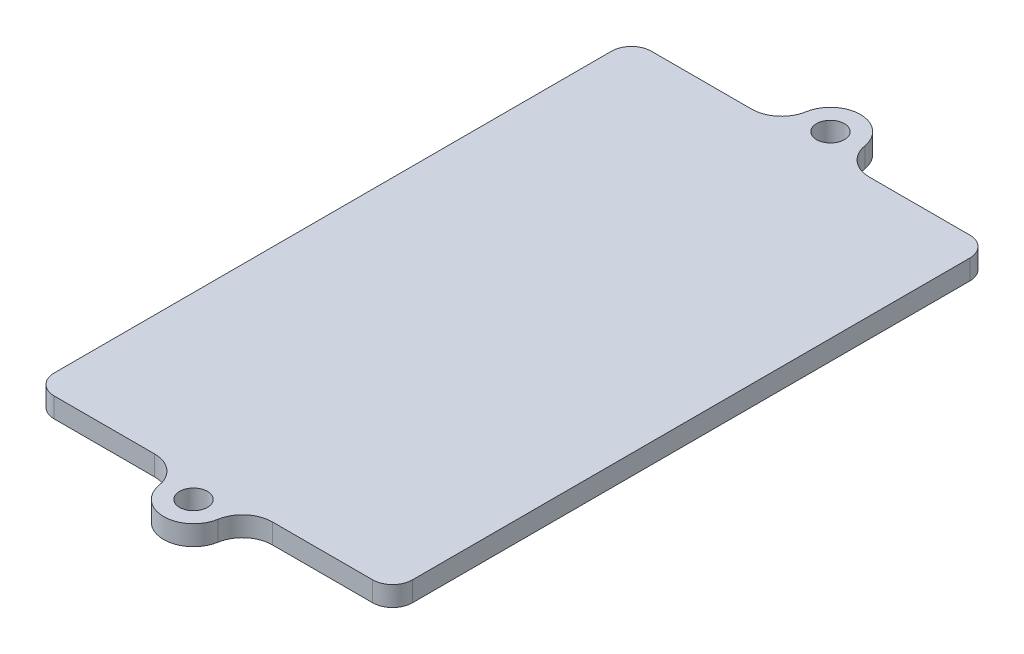
ISO-10303-21;
HEADER;
FILE_DESCRIPTION(('STEP AP214'),'2;1');
FILE_NAME('part.step','',(''),(''),'','','');
FILE_SCHEMA(('AUTOMOTIVE_DESIGN { 1 0 10303 214 1 1 1 1 }'));
ENDSEC;
DATA;
#1=APPLICATION_CONTEXT('core data for automotive mechanical design processes');
#2=APPLICATION_PROTOCOL_DEFINITION('international standard','automotive_design',2000,#1);
#3=PRODUCT_CONTEXT('',#1,'mechanical');
#4=PRODUCT('Part','Part','',(#3));
#5=PRODUCT_RELATED_PRODUCT_CATEGORY('part','',(#4));
#6=PRODUCT_DEFINITION_FORMATION('','',#4);
#7=PRODUCT_DEFINITION_CONTEXT('part definition',#1,'design');
#8=PRODUCT_DEFINITION('design','',#6,#7);
#9=PRODUCT_DEFINITION_SHAPE('','',#8);
#10=(LENGTH_UNIT() NAMED_UNIT(*) SI_UNIT(.MILLI.,.METRE.));
#11=(NAMED_UNIT(*) PLANE_ANGLE_UNIT() SI_UNIT($,.RADIAN.));
#12=(NAMED_UNIT(*) SI_UNIT($,.STERADIAN.) SOLID_ANGLE_UNIT());
#13=UNCERTAINTY_MEASURE_WITH_UNIT(LENGTH_MEASURE(1.E-05),#10,'distance_accuracy_value','');
#14=(GEOMETRIC_REPRESENTATION_CONTEXT(3) GLOBAL_UNCERTAINTY_ASSIGNED_CONTEXT((#13)) GLOBAL_UNIT_ASSIGNED_CONTEXT((#10,
#11,#12)) REPRESENTATION_CONTEXT('',''));
#15=CARTESIAN_POINT('',(0.,0.,0.));
#16=DIRECTION('',(0.,0.,1.));
#17=DIRECTION('',(1.,0.,0.));
#18=AXIS2_PLACEMENT_3D('',#15,#16,#17);
#19=CARTESIAN_POINT('',(-18.,2.,30.));
#20=DIRECTION('',(0.,0.,-1.));
#21=DIRECTION('',(-1.,0.,0.));
#22=AXIS2_PLACEMENT_3D('',#19,#20,#21);
#23=PLANE('',#22);
#24=DIRECTION('',(1.,0.,0.));
#25=VECTOR('',#24,1.);
#26=CARTESIAN_POINT('',(-18.,0.,30.));
#27=LINE('',#26,#25);
#28=CARTESIAN_POINT('',(-16.,0.,30.));
#29=VERTEX_POINT('',#28);
#30=CARTESIAN_POINT('',(-5.91607978309962,0.,30.));
#31=VERTEX_POINT('',#30);
#32=EDGE_CURVE('E172',#29,#31,#27,.T.);
#33=ORIENTED_EDGE('',*,*,#32,.T.);
#34=DIRECTION('',(0.,-1.,0.));
#35=VECTOR('',#34,1.);
#36=CARTESIAN_POINT('',(-5.91607978309962,2.,30.));
#37=LINE('',#36,#35);
#38=CARTESIAN_POINT('',(-5.91607978309962,2.,30.));
#39=VERTEX_POINT('',#38);
#40=EDGE_CURVE('E247',#31,#39,#37,.F.);
#41=ORIENTED_EDGE('',*,*,#40,.T.);
#42=DIRECTION('',(1.,0.,0.));
#43=VECTOR('',#42,1.);
#44=CARTESIAN_POINT('',(-18.,2.,30.));
#45=LINE('',#44,#43);
#46=CARTESIAN_POINT('',(-16.,2.,30.));
#47=VERTEX_POINT('',#46);
#48=EDGE_CURVE('E175',#47,#39,#45,.T.);
#49=ORIENTED_EDGE('',*,*,#48,.F.);
#50=DIRECTION('',(0.,-1.,0.));
#51=VECTOR('',#50,1.);
#52=CARTESIAN_POINT('',(-16.,2.,30.));
#53=LINE('',#52,#51);
#54=EDGE_CURVE('E159',#47,#29,#53,.T.);
#55=ORIENTED_EDGE('',*,*,#54,.T.);
#56=EDGE_LOOP('',(#33,#41,#49,#55));
#57=FACE_BOUND('',#56,.T.);
#58=ADVANCED_FACE('F41',(#57),#23,.F.);
#59=CARTESIAN_POINT('',(5.91607978309962,2.,30.));
#60=VERTEX_POINT('',#59);
#61=CARTESIAN_POINT('',(16.,2.,30.));
#62=VERTEX_POINT('',#61);
#63=EDGE_CURVE('E327',#60,#62,#45,.T.);
#64=ORIENTED_EDGE('',*,*,#63,.F.);
#65=DIRECTION('',(0.,-1.,0.));
#66=VECTOR('',#65,1.);
#67=CARTESIAN_POINT('',(5.91607978309962,0.,30.));
#68=LINE('',#67,#66);
#69=CARTESIAN_POINT('',(5.91607978309962,0.,30.));
#70=VERTEX_POINT('',#69);
#71=EDGE_CURVE('E257',#60,#70,#68,.T.);
#72=ORIENTED_EDGE('',*,*,#71,.T.);
#73=CARTESIAN_POINT('',(16.,0.,30.));
#74=VERTEX_POINT('',#73);
#75=EDGE_CURVE('E187',#70,#74,#27,.T.);
#76=ORIENTED_EDGE('',*,*,#75,.T.);
#77=DIRECTION('',(0.,-1.,0.));
#78=VECTOR('',#77,1.);
#79=CARTESIAN_POINT('',(16.,2.,30.));
#80=LINE('',#79,#78);
#81=EDGE_CURVE('E178',#74,#62,#80,.F.);
#82=ORIENTED_EDGE('',*,*,#81,.T.);
#83=EDGE_LOOP('',(#64,#72,#76,#82));
#84=FACE_BOUND('',#83,.T.);
#85=ADVANCED_FACE('F393',(#84),#23,.F.);
#86=CARTESIAN_POINT('',(-18.,2.,-30.));
#87=DIRECTION('',(0.,0.,1.));
#88=DIRECTION('',(1.,0.,0.));
#89=AXIS2_PLACEMENT_3D('',#86,#87,#88);
#90=PLANE('',#89);
#91=DIRECTION('',(-1.,0.,0.));
#92=VECTOR('',#91,1.);
#93=CARTESIAN_POINT('',(-18.,0.,-30.));
#94=LINE('',#93,#92);
#95=CARTESIAN_POINT('',(16.,0.,-30.));
#96=VERTEX_POINT('',#95);
#97=CARTESIAN_POINT('',(5.91607978309962,0.,-30.));
#98=VERTEX_POINT('',#97);
#99=EDGE_CURVE('E198',#96,#98,#94,.T.);
#100=ORIENTED_EDGE('',*,*,#99,.T.);
#101=DIRECTION('',(0.,1.,0.));
#102=VECTOR('',#101,1.);
#103=CARTESIAN_POINT('',(5.91607978309962,2.,-30.));
#104=LINE('',#103,#102);
#105=CARTESIAN_POINT('',(5.91607978309962,2.,-30.));
#106=VERTEX_POINT('',#105);
#107=EDGE_CURVE('E270',#98,#106,#104,.T.);
#108=ORIENTED_EDGE('',*,*,#107,.T.);
#109=DIRECTION('',(-1.,0.,0.));
#110=VECTOR('',#109,1.);
#111=CARTESIAN_POINT('',(-18.,2.,-30.));
#112=LINE('',#111,#110);
#113=CARTESIAN_POINT('',(16.,2.,-30.));
#114=VERTEX_POINT('',#113);
#115=EDGE_CURVE('E204',#114,#106,#112,.T.);
#116=ORIENTED_EDGE('',*,*,#115,.F.);
#117=DIRECTION('',(0.,-1.,0.));
#118=VECTOR('',#117,1.);
#119=CARTESIAN_POINT('',(16.,2.,-30.));
#120=LINE('',#119,#118);
#121=EDGE_CURVE('E243',#114,#96,#120,.T.);
#122=ORIENTED_EDGE('',*,*,#121,.T.);
#123=EDGE_LOOP('',(#100,#108,#116,#122));
#124=FACE_BOUND('',#123,.T.);
#125=ADVANCED_FACE('F308',(#124),#90,.F.);
#126=CARTESIAN_POINT('',(-18.,2.,-30.));
#127=DIRECTION('',(1.,0.,0.));
#128=DIRECTION('',(0.,0.,-1.));
#129=AXIS2_PLACEMENT_3D('',#126,#127,#128);
#130=PLANE('',#129);
#131=DIRECTION('',(0.,0.,1.));
#132=VECTOR('',#131,1.);
#133=CARTESIAN_POINT('',(-18.,0.,-30.));
#134=LINE('',#133,#132);
#135=CARTESIAN_POINT('',(-18.,0.,-28.));
#136=VERTEX_POINT('',#135);
#137=CARTESIAN_POINT('',(-18.,0.,28.));
#138=VERTEX_POINT('',#137);
#139=EDGE_CURVE('E194',#136,#138,#134,.T.);
#140=ORIENTED_EDGE('',*,*,#139,.T.);
#141=DIRECTION('',(0.,-1.,0.));
#142=VECTOR('',#141,1.);
#143=CARTESIAN_POINT('',(-18.,2.,28.));
#144=LINE('',#143,#142);
#145=CARTESIAN_POINT('',(-18.,2.,28.));
#146=VERTEX_POINT('',#145);
#147=EDGE_CURVE('E160',#138,#146,#144,.F.);
#148=ORIENTED_EDGE('',*,*,#147,.T.);
#149=DIRECTION('',(0.,0.,1.));
#150=VECTOR('',#149,1.);
#151=CARTESIAN_POINT('',(-18.,2.,-30.));
#152=LINE('',#151,#150);
#153=CARTESIAN_POINT('',(-18.,2.,-28.));
#154=VERTEX_POINT('',#153);
#155=EDGE_CURVE('E201',#154,#146,#152,.T.);
#156=ORIENTED_EDGE('',*,*,#155,.F.);
#157=DIRECTION('',(0.,-1.,0.));
#158=VECTOR('',#157,1.);
#159=CARTESIAN_POINT('',(-18.,2.,-28.));
#160=LINE('',#159,#158);
#161=EDGE_CURVE('E165',#154,#136,#160,.T.);
#162=ORIENTED_EDGE('',*,*,#161,.T.);
#163=EDGE_LOOP('',(#140,#148,#156,#162));
#164=FACE_BOUND('',#163,.T.);
#165=ADVANCED_FACE('F369',(#164),#130,.F.);
#166=CARTESIAN_POINT('',(18.,2.,-30.));
#167=DIRECTION('',(-1.,0.,0.));
#168=DIRECTION('',(0.,0.,1.));
#169=AXIS2_PLACEMENT_3D('',#166,#167,#168);
#170=PLANE('',#169);
#171=DIRECTION('',(0.,0.,-1.));
#172=VECTOR('',#171,1.);
#173=CARTESIAN_POINT('',(18.,2.,-30.));
#174=LINE('',#173,#172);
#175=CARTESIAN_POINT('',(18.,2.,28.));
#176=VERTEX_POINT('',#175);
#177=CARTESIAN_POINT('',(18.,2.,-28.));
#178=VERTEX_POINT('',#177);
#179=EDGE_CURVE('E320',#176,#178,#174,.T.);
#180=ORIENTED_EDGE('',*,*,#179,.F.);
#181=DIRECTION('',(0.,-1.,0.));
#182=VECTOR('',#181,1.);
#183=CARTESIAN_POINT('',(18.,2.,28.));
#184=LINE('',#183,#182);
#185=CARTESIAN_POINT('',(18.,0.,28.));
#186=VERTEX_POINT('',#185);
#187=EDGE_CURVE('E235',#176,#186,#184,.T.);
#188=ORIENTED_EDGE('',*,*,#187,.T.);
#189=DIRECTION('',(0.,0.,-1.));
#190=VECTOR('',#189,1.);
#191=CARTESIAN_POINT('',(18.,0.,-30.));
#192=LINE('',#191,#190);
#193=CARTESIAN_POINT('',(18.,0.,-28.));
#194=VERTEX_POINT('',#193);
#195=EDGE_CURVE('E186',#186,#194,#192,.T.);
#196=ORIENTED_EDGE('',*,*,#195,.T.);
#197=DIRECTION('',(0.,-1.,0.));
#198=VECTOR('',#197,1.);
#199=CARTESIAN_POINT('',(18.,2.,-28.));
#200=LINE('',#199,#198);
#201=EDGE_CURVE('E232',#194,#178,#200,.F.);
#202=ORIENTED_EDGE('',*,*,#201,.T.);
#203=EDGE_LOOP('',(#180,#188,#196,#202));
#204=FACE_BOUND('',#203,.T.);
#205=ADVANCED_FACE('F315',(#204),#170,.F.);
#206=CARTESIAN_POINT('',(-5.91607978309962,2.,-30.));
#207=VERTEX_POINT('',#206);
#208=CARTESIAN_POINT('',(-16.,2.,-30.));
#209=VERTEX_POINT('',#208);
#210=EDGE_CURVE('E323',#207,#209,#112,.T.);
#211=ORIENTED_EDGE('',*,*,#210,.F.);
#212=DIRECTION('',(0.,1.,0.));
#213=VECTOR('',#212,1.);
#214=CARTESIAN_POINT('',(-5.91607978309962,2.,-30.));
#215=LINE('',#214,#213);
#216=CARTESIAN_POINT('',(-5.91607978309962,0.,-30.));
#217=VERTEX_POINT('',#216);
#218=EDGE_CURVE('E267',#207,#217,#215,.F.);
#219=ORIENTED_EDGE('',*,*,#218,.T.);
#220=CARTESIAN_POINT('',(-16.,0.,-30.));
#221=VERTEX_POINT('',#220);
#222=EDGE_CURVE('E192',#217,#221,#94,.T.);
#223=ORIENTED_EDGE('',*,*,#222,.T.);
#224=DIRECTION('',(0.,-1.,0.));
#225=VECTOR('',#224,1.);
#226=CARTESIAN_POINT('',(-16.,2.,-30.));
#227=LINE('',#226,#225);
#228=EDGE_CURVE('E239',#221,#209,#227,.F.);
#229=ORIENTED_EDGE('',*,*,#228,.T.);
#230=EDGE_LOOP('',(#211,#219,#223,#229));
#231=FACE_BOUND('',#230,.T.);
#232=ADVANCED_FACE('F382',(#231),#90,.F.);
#233=CARTESIAN_POINT('',(0.,2.,0.));
#234=DIRECTION('',(0.,1.,0.));
#235=DIRECTION('',(0.,0.,1.));
#236=AXIS2_PLACEMENT_3D('',#233,#234,#235);
#237=PLANE('',#236);
#238=ORIENTED_EDGE('',*,*,#155,.T.);
#239=CARTESIAN_POINT('',(-16.,2.,28.));
#240=DIRECTION('',(0.,1.,0.));
#241=DIRECTION('',(0.,0.,1.));
#242=AXIS2_PLACEMENT_3D('',#239,#240,#241);
#243=CIRCLE('',#242,2.);
#244=EDGE_CURVE('E229',#146,#47,#243,.T.);
#245=ORIENTED_EDGE('',*,*,#244,.T.);
#246=ORIENTED_EDGE('',*,*,#48,.T.);
#247=CARTESIAN_POINT('',(-5.91607978309962,2.,33.));
#248=DIRECTION('',(0.,1.,0.));
#249=DIRECTION('',(0.,0.,1.));
#250=AXIS2_PLACEMENT_3D('',#247,#248,#249);
#251=CIRCLE('',#250,3.);
#252=CARTESIAN_POINT('',(-2.95803989154981,2.,32.5));
#253=VERTEX_POINT('',#252);
#254=EDGE_CURVE('E273',#39,#253,#251,.F.);
#255=ORIENTED_EDGE('',*,*,#254,.T.);
#256=CARTESIAN_POINT('',(0.,2.,32.));
#257=DIRECTION('',(0.,1.,0.));
#258=DIRECTION('',(0.,0.,1.));
#259=AXIS2_PLACEMENT_3D('',#256,#257,#258);
#260=CIRCLE('',#259,3.);
#261=CARTESIAN_POINT('',(2.95803989154981,2.,32.5));
#262=VERTEX_POINT('',#261);
#263=EDGE_CURVE('E348',#262,#253,#260,.F.);
#264=ORIENTED_EDGE('',*,*,#263,.F.);
#265=CARTESIAN_POINT('',(5.91607978309962,2.,33.));
#266=DIRECTION('',(0.,1.,0.));
#267=DIRECTION('',(0.,0.,1.));
#268=AXIS2_PLACEMENT_3D('',#265,#266,#267);
#269=CIRCLE('',#268,3.);
#270=EDGE_CURVE('E278',#262,#60,#269,.F.);
#271=ORIENTED_EDGE('',*,*,#270,.T.);
#272=ORIENTED_EDGE('',*,*,#63,.T.);
#273=CARTESIAN_POINT('',(16.,2.,28.));
#274=DIRECTION('',(0.,1.,0.));
#275=DIRECTION('',(0.,0.,1.));
#276=AXIS2_PLACEMENT_3D('',#273,#274,#275);
#277=CIRCLE('',#276,2.);
#278=EDGE_CURVE('E226',#62,#176,#277,.T.);
#279=ORIENTED_EDGE('',*,*,#278,.T.);
#280=ORIENTED_EDGE('',*,*,#179,.T.);
#281=CARTESIAN_POINT('',(16.,2.,-28.));
#282=DIRECTION('',(0.,1.,0.));
#283=DIRECTION('',(0.,0.,1.));
#284=AXIS2_PLACEMENT_3D('',#281,#282,#283);
#285=CIRCLE('',#284,2.);
#286=EDGE_CURVE('E223',#178,#114,#285,.T.);
#287=ORIENTED_EDGE('',*,*,#286,.T.);
#288=ORIENTED_EDGE('',*,*,#115,.T.);
#289=CARTESIAN_POINT('',(5.91607978309962,2.,-33.));
#290=DIRECTION('',(0.,1.,0.));
#291=DIRECTION('',(0.,0.,1.));
#292=AXIS2_PLACEMENT_3D('',#289,#290,#291);
#293=CIRCLE('',#292,3.);
#294=CARTESIAN_POINT('',(2.95803989154981,2.,-32.5));
#295=VERTEX_POINT('',#294);
#296=EDGE_CURVE('E50',#106,#295,#293,.F.);
#297=ORIENTED_EDGE('',*,*,#296,.T.);
#298=CARTESIAN_POINT('',(0.,2.,-32.));
#299=DIRECTION('',(0.,1.,0.));
#300=DIRECTION('',(0.,0.,1.));
#301=AXIS2_PLACEMENT_3D('',#298,#299,#300);
#302=CIRCLE('',#301,3.);
#303=CARTESIAN_POINT('',(-2.95803989154981,2.,-32.5));
#304=VERTEX_POINT('',#303);
#305=EDGE_CURVE('E297',#295,#304,#302,.T.);
#306=ORIENTED_EDGE('',*,*,#305,.T.);
#307=CARTESIAN_POINT('',(-5.91607978309962,2.,-33.));
#308=DIRECTION('',(0.,1.,0.));
#309=DIRECTION('',(0.,0.,1.));
#310=AXIS2_PLACEMENT_3D('',#307,#308,#309);
#311=CIRCLE('',#310,3.);
#312=EDGE_CURVE('E284',#304,#207,#311,.F.);
#313=ORIENTED_EDGE('',*,*,#312,.T.);
#314=ORIENTED_EDGE('',*,*,#210,.T.);
#315=CARTESIAN_POINT('',(-16.,2.,-28.));
#316=DIRECTION('',(0.,1.,0.));
#317=DIRECTION('',(0.,0.,1.));
#318=AXIS2_PLACEMENT_3D('',#315,#316,#317);
#319=CIRCLE('',#318,2.);
#320=EDGE_CURVE('E220',#209,#154,#319,.T.);
#321=ORIENTED_EDGE('',*,*,#320,.T.);
#322=EDGE_LOOP('',(#238,#245,#246,#255,#264,#271,#272,#279,#280,#287,#288,#297,#306,#313,#314,#321));
#323=FACE_BOUND('',#322,.T.);
#324=CARTESIAN_POINT('',(0.,2.,-32.));
#325=DIRECTION('',(0.,1.,0.));
#326=DIRECTION('',(0.,0.,1.));
#327=AXIS2_PLACEMENT_3D('',#324,#325,#326);
#328=CIRCLE('',#327,1.4);
#329=CARTESIAN_POINT('',(0.,2.,-30.6));
#330=VERTEX_POINT('',#329);
#331=EDGE_CURVE('E305',#330,#330,#328,.T.);
#332=ORIENTED_EDGE('',*,*,#331,.F.);
#333=EDGE_LOOP('',(#332));
#334=FACE_BOUND('',#333,.T.);
#335=CARTESIAN_POINT('',(0.,2.,32.));
#336=DIRECTION('',(0.,1.,0.));
#337=DIRECTION('',(0.,0.,1.));
#338=AXIS2_PLACEMENT_3D('',#335,#336,#337);
#339=CIRCLE('',#338,1.4);
#340=CARTESIAN_POINT('',(0.,2.,33.4));
#341=VERTEX_POINT('',#340);
#342=EDGE_CURVE('E343',#341,#341,#339,.F.);
#343=ORIENTED_EDGE('',*,*,#342,.T.);
#344=EDGE_LOOP('',(#343));
#345=FACE_BOUND('',#344,.T.);
#346=ADVANCED_FACE('F295',(#323,#334,#345),#237,.T.);
#347=CARTESIAN_POINT('',(0.,0.,0.));
#348=DIRECTION('',(0.,1.,0.));
#349=DIRECTION('',(0.,0.,1.));
#350=AXIS2_PLACEMENT_3D('',#347,#348,#349);
#351=PLANE('',#350);
#352=ORIENTED_EDGE('',*,*,#32,.F.);
#353=CARTESIAN_POINT('',(-16.,0.,28.));
#354=DIRECTION('',(0.,1.,0.));
#355=DIRECTION('',(0.,0.,1.));
#356=AXIS2_PLACEMENT_3D('',#353,#354,#355);
#357=CIRCLE('',#356,2.);
#358=EDGE_CURVE('E155',#29,#138,#357,.F.);
#359=ORIENTED_EDGE('',*,*,#358,.T.);
#360=ORIENTED_EDGE('',*,*,#139,.F.);
#361=CARTESIAN_POINT('',(-16.,0.,-28.));
#362=DIRECTION('',(0.,1.,0.));
#363=DIRECTION('',(0.,0.,1.));
#364=AXIS2_PLACEMENT_3D('',#361,#362,#363);
#365=CIRCLE('',#364,2.);
#366=EDGE_CURVE('E177',#136,#221,#365,.F.);
#367=ORIENTED_EDGE('',*,*,#366,.T.);
#368=ORIENTED_EDGE('',*,*,#222,.F.);
#369=CARTESIAN_POINT('',(-5.91607978309962,0.,-33.));
#370=DIRECTION('',(0.,1.,0.));
#371=DIRECTION('',(0.,0.,1.));
#372=AXIS2_PLACEMENT_3D('',#369,#370,#371);
#373=CIRCLE('',#372,3.);
#374=CARTESIAN_POINT('',(-2.95803989154981,0.,-32.5));
#375=VERTEX_POINT('',#374);
#376=EDGE_CURVE('E287',#217,#375,#373,.T.);
#377=ORIENTED_EDGE('',*,*,#376,.T.);
#378=CARTESIAN_POINT('',(0.,0.,-32.));
#379=DIRECTION('',(0.,1.,0.));
#380=DIRECTION('',(0.,0.,1.));
#381=AXIS2_PLACEMENT_3D('',#378,#379,#380);
#382=CIRCLE('',#381,3.);
#383=CARTESIAN_POINT('',(2.95803989154981,0.,-32.5));
#384=VERTEX_POINT('',#383);
#385=EDGE_CURVE('E337',#384,#375,#382,.T.);
#386=ORIENTED_EDGE('',*,*,#385,.F.);
#387=CARTESIAN_POINT('',(5.91607978309962,0.,-33.));
#388=DIRECTION('',(0.,1.,0.));
#389=DIRECTION('',(0.,0.,1.));
#390=AXIS2_PLACEMENT_3D('',#387,#388,#389);
#391=CIRCLE('',#390,3.);
#392=EDGE_CURVE('E11',#384,#98,#391,.T.);
#393=ORIENTED_EDGE('',*,*,#392,.T.);
#394=ORIENTED_EDGE('',*,*,#99,.F.);
#395=CARTESIAN_POINT('',(16.,0.,-28.));
#396=DIRECTION('',(0.,1.,0.));
#397=DIRECTION('',(0.,0.,1.));
#398=AXIS2_PLACEMENT_3D('',#395,#396,#397);
#399=CIRCLE('',#398,2.);
#400=EDGE_CURVE('E209',#96,#194,#399,.F.);
#401=ORIENTED_EDGE('',*,*,#400,.T.);
#402=ORIENTED_EDGE('',*,*,#195,.F.);
#403=CARTESIAN_POINT('',(16.,0.,28.));
#404=DIRECTION('',(0.,1.,0.));
#405=DIRECTION('',(0.,0.,1.));
#406=AXIS2_PLACEMENT_3D('',#403,#404,#405);
#407=CIRCLE('',#406,2.);
#408=EDGE_CURVE('E166',#186,#74,#407,.F.);
#409=ORIENTED_EDGE('',*,*,#408,.T.);
#410=ORIENTED_EDGE('',*,*,#75,.F.);
#411=CARTESIAN_POINT('',(5.91607978309962,0.,33.));
#412=DIRECTION('',(0.,1.,0.));
#413=DIRECTION('',(0.,0.,1.));
#414=AXIS2_PLACEMENT_3D('',#411,#412,#413);
#415=CIRCLE('',#414,3.);
#416=CARTESIAN_POINT('',(2.95803989154981,0.,32.5));
#417=VERTEX_POINT('',#416);
#418=EDGE_CURVE('E281',#70,#417,#415,.T.);
#419=ORIENTED_EDGE('',*,*,#418,.T.);
#420=CARTESIAN_POINT('',(0.,0.,32.));
#421=DIRECTION('',(0.,1.,0.));
#422=DIRECTION('',(0.,0.,1.));
#423=AXIS2_PLACEMENT_3D('',#420,#421,#422);
#424=CIRCLE('',#423,3.);
#425=CARTESIAN_POINT('',(-2.95803989154981,0.,32.5));
#426=VERTEX_POINT('',#425);
#427=EDGE_CURVE('E347',#417,#426,#424,.F.);
#428=ORIENTED_EDGE('',*,*,#427,.T.);
#429=CARTESIAN_POINT('',(-5.91607978309962,0.,33.));
#430=DIRECTION('',(0.,1.,0.));
#431=DIRECTION('',(0.,0.,1.));
#432=AXIS2_PLACEMENT_3D('',#429,#430,#431);
#433=CIRCLE('',#432,3.);
#434=EDGE_CURVE('E184',#426,#31,#433,.T.);
#435=ORIENTED_EDGE('',*,*,#434,.T.);
#436=EDGE_LOOP('',(#352,#359,#360,#367,#368,#377,#386,#393,#394,#401,#402,#409,#410,#419,#428,#435));
#437=FACE_BOUND('',#436,.T.);
#438=CARTESIAN_POINT('',(0.,0.,-32.));
#439=DIRECTION('',(0.,1.,0.));
#440=DIRECTION('',(0.,0.,1.));
#441=AXIS2_PLACEMENT_3D('',#438,#439,#440);
#442=CIRCLE('',#441,1.4);
#443=CARTESIAN_POINT('',(0.,0.,-30.6));
#444=VERTEX_POINT('',#443);
#445=EDGE_CURVE('E304',#444,#444,#442,.T.);
#446=ORIENTED_EDGE('',*,*,#445,.T.);
#447=EDGE_LOOP('',(#446));
#448=FACE_BOUND('',#447,.T.);
#449=CARTESIAN_POINT('',(0.,0.,32.));
#450=DIRECTION('',(0.,1.,0.));
#451=DIRECTION('',(0.,0.,1.));
#452=AXIS2_PLACEMENT_3D('',#449,#450,#451);
#453=CIRCLE('',#452,1.4);
#454=CARTESIAN_POINT('',(0.,0.,33.4));
#455=VERTEX_POINT('',#454);
#456=EDGE_CURVE('E336',#455,#455,#453,.F.);
#457=ORIENTED_EDGE('',*,*,#456,.F.);
#458=EDGE_LOOP('',(#457));
#459=FACE_BOUND('',#458,.T.);
#460=ADVANCED_FACE('F180',(#437,#448,#459),#351,.F.);
#461=CARTESIAN_POINT('',(-16.,2.,28.));
#462=DIRECTION('',(0.,-1.,0.));
#463=DIRECTION('',(0.,0.,-1.));
#464=AXIS2_PLACEMENT_3D('',#461,#462,#463);
#465=CYLINDRICAL_SURFACE('',#464,2.);
#466=ORIENTED_EDGE('',*,*,#244,.F.);
#467=ORIENTED_EDGE('',*,*,#147,.F.);
#468=ORIENTED_EDGE('',*,*,#358,.F.);
#469=ORIENTED_EDGE('',*,*,#54,.F.);
#470=EDGE_LOOP('',(#466,#467,#468,#469));
#471=FACE_BOUND('',#470,.T.);
#472=ADVANCED_FACE('F158',(#471),#465,.T.);
#473=CARTESIAN_POINT('',(16.,2.,28.));
#474=DIRECTION('',(0.,-1.,0.));
#475=DIRECTION('',(0.,0.,-1.));
#476=AXIS2_PLACEMENT_3D('',#473,#474,#475);
#477=CYLINDRICAL_SURFACE('',#476,2.);
#478=ORIENTED_EDGE('',*,*,#278,.F.);
#479=ORIENTED_EDGE('',*,*,#81,.F.);
#480=ORIENTED_EDGE('',*,*,#408,.F.);
#481=ORIENTED_EDGE('',*,*,#187,.F.);
#482=EDGE_LOOP('',(#478,#479,#480,#481));
#483=FACE_BOUND('',#482,.T.);
#484=ADVANCED_FACE('F405',(#483),#477,.T.);
#485=CARTESIAN_POINT('',(16.,2.,-28.));
#486=DIRECTION('',(0.,-1.,0.));
#487=DIRECTION('',(0.,0.,-1.));
#488=AXIS2_PLACEMENT_3D('',#485,#486,#487);
#489=CYLINDRICAL_SURFACE('',#488,2.);
#490=ORIENTED_EDGE('',*,*,#286,.F.);
#491=ORIENTED_EDGE('',*,*,#201,.F.);
#492=ORIENTED_EDGE('',*,*,#400,.F.);
#493=ORIENTED_EDGE('',*,*,#121,.F.);
#494=EDGE_LOOP('',(#490,#491,#492,#493));
#495=FACE_BOUND('',#494,.T.);
#496=ADVANCED_FACE('F319',(#495),#489,.T.);
#497=CARTESIAN_POINT('',(-16.,2.,-28.));
#498=DIRECTION('',(0.,-1.,0.));
#499=DIRECTION('',(0.,0.,-1.));
#500=AXIS2_PLACEMENT_3D('',#497,#498,#499);
#501=CYLINDRICAL_SURFACE('',#500,2.);
#502=ORIENTED_EDGE('',*,*,#320,.F.);
#503=ORIENTED_EDGE('',*,*,#228,.F.);
#504=ORIENTED_EDGE('',*,*,#366,.F.);
#505=ORIENTED_EDGE('',*,*,#161,.F.);
#506=EDGE_LOOP('',(#502,#503,#504,#505));
#507=FACE_BOUND('',#506,.T.);
#508=ADVANCED_FACE('F371',(#507),#501,.T.);
#509=CARTESIAN_POINT('',(0.,0.,-32.));
#510=DIRECTION('',(0.,1.,0.));
#511=DIRECTION('',(0.,0.,1.));
#512=AXIS2_PLACEMENT_3D('',#509,#510,#511);
#513=CYLINDRICAL_SURFACE('',#512,1.4);
#514=ORIENTED_EDGE('',*,*,#445,.F.);
#515=EDGE_LOOP('',(#514));
#516=FACE_BOUND('',#515,.T.);
#517=ORIENTED_EDGE('',*,*,#331,.T.);
#518=EDGE_LOOP('',(#517));
#519=FACE_BOUND('',#518,.T.);
#520=ADVANCED_FACE('F413',(#516,#519),#513,.F.);
#521=CARTESIAN_POINT('',(0.,0.,-32.));
#522=DIRECTION('',(0.,1.,0.));
#523=DIRECTION('',(0.,0.,1.));
#524=AXIS2_PLACEMENT_3D('',#521,#522,#523);
#525=CYLINDRICAL_SURFACE('',#524,3.);
#526=ORIENTED_EDGE('',*,*,#385,.T.);
#527=DIRECTION('',(0.,1.,0.));
#528=VECTOR('',#527,1.);
#529=CARTESIAN_POINT('',(-2.95803989154981,0.,-32.5));
#530=LINE('',#529,#528);
#531=EDGE_CURVE('E263',#375,#304,#530,.T.);
#532=ORIENTED_EDGE('',*,*,#531,.T.);
#533=ORIENTED_EDGE('',*,*,#305,.F.);
#534=DIRECTION('',(0.,1.,0.));
#535=VECTOR('',#534,1.);
#536=CARTESIAN_POINT('',(2.95803989154981,0.,-32.5));
#537=LINE('',#536,#535);
#538=EDGE_CURVE('E260',#295,#384,#537,.F.);
#539=ORIENTED_EDGE('',*,*,#538,.T.);
#540=EDGE_LOOP('',(#526,#532,#533,#539));
#541=FACE_BOUND('',#540,.T.);
#542=ADVANCED_FACE('F301',(#541),#525,.T.);
#543=CARTESIAN_POINT('',(0.,0.,32.));
#544=DIRECTION('',(0.,1.,0.));
#545=DIRECTION('',(0.,0.,1.));
#546=AXIS2_PLACEMENT_3D('',#543,#544,#545);
#547=CYLINDRICAL_SURFACE('',#546,3.);
#548=ORIENTED_EDGE('',*,*,#263,.T.);
#549=DIRECTION('',(0.,1.,0.));
#550=VECTOR('',#549,1.);
#551=CARTESIAN_POINT('',(-2.95803989154981,0.,32.5));
#552=LINE('',#551,#550);
#553=EDGE_CURVE('E254',#253,#426,#552,.F.);
#554=ORIENTED_EDGE('',*,*,#553,.T.);
#555=ORIENTED_EDGE('',*,*,#427,.F.);
#556=DIRECTION('',(0.,1.,0.));
#557=VECTOR('',#556,1.);
#558=CARTESIAN_POINT('',(2.95803989154981,0.,32.5));
#559=LINE('',#558,#557);
#560=EDGE_CURVE('E250',#417,#262,#559,.T.);
#561=ORIENTED_EDGE('',*,*,#560,.T.);
#562=EDGE_LOOP('',(#548,#554,#555,#561));
#563=FACE_BOUND('',#562,.T.);
#564=ADVANCED_FACE('F449',(#563),#547,.T.);
#565=CARTESIAN_POINT('',(0.,0.,32.));
#566=DIRECTION('',(0.,1.,0.));
#567=DIRECTION('',(0.,0.,1.));
#568=AXIS2_PLACEMENT_3D('',#565,#566,#567);
#569=CYLINDRICAL_SURFACE('',#568,1.4);
#570=ORIENTED_EDGE('',*,*,#456,.T.);
#571=EDGE_LOOP('',(#570));
#572=FACE_BOUND('',#571,.T.);
#573=ORIENTED_EDGE('',*,*,#342,.F.);
#574=EDGE_LOOP('',(#573));
#575=FACE_BOUND('',#574,.T.);
#576=ADVANCED_FACE('F417',(#572,#575),#569,.F.);
#577=CARTESIAN_POINT('',(-5.91607978309962,0.,33.));
#578=DIRECTION('',(0.,1.,0.));
#579=DIRECTION('',(0.,0.,1.));
#580=AXIS2_PLACEMENT_3D('',#577,#578,#579);
#581=CYLINDRICAL_SURFACE('',#580,3.);
#582=ORIENTED_EDGE('',*,*,#434,.F.);
#583=ORIENTED_EDGE('',*,*,#553,.F.);
#584=ORIENTED_EDGE('',*,*,#254,.F.);
#585=ORIENTED_EDGE('',*,*,#40,.F.);
#586=EDGE_LOOP('',(#582,#583,#584,#585));
#587=FACE_BOUND('',#586,.T.);
#588=ADVANCED_FACE('F363',(#587),#581,.F.);
#589=CARTESIAN_POINT('',(5.91607978309962,0.,33.));
#590=DIRECTION('',(0.,1.,0.));
#591=DIRECTION('',(0.,0.,1.));
#592=AXIS2_PLACEMENT_3D('',#589,#590,#591);
#593=CYLINDRICAL_SURFACE('',#592,3.);
#594=ORIENTED_EDGE('',*,*,#418,.F.);
#595=ORIENTED_EDGE('',*,*,#71,.F.);
#596=ORIENTED_EDGE('',*,*,#270,.F.);
#597=ORIENTED_EDGE('',*,*,#560,.F.);
#598=EDGE_LOOP('',(#594,#595,#596,#597));
#599=FACE_BOUND('',#598,.T.);
#600=ADVANCED_FACE('F416',(#599),#593,.F.);
#601=CARTESIAN_POINT('',(-5.91607978309962,0.,-33.));
#602=DIRECTION('',(0.,1.,0.));
#603=DIRECTION('',(0.,0.,1.));
#604=AXIS2_PLACEMENT_3D('',#601,#602,#603);
#605=CYLINDRICAL_SURFACE('',#604,3.);
#606=ORIENTED_EDGE('',*,*,#376,.F.);
#607=ORIENTED_EDGE('',*,*,#218,.F.);
#608=ORIENTED_EDGE('',*,*,#312,.F.);
#609=ORIENTED_EDGE('',*,*,#531,.F.);
#610=EDGE_LOOP('',(#606,#607,#608,#609));
#611=FACE_BOUND('',#610,.T.);
#612=ADVANCED_FACE('F380',(#611),#605,.F.);
#613=CARTESIAN_POINT('',(5.91607978309962,0.,-33.));
#614=DIRECTION('',(0.,1.,0.));
#615=DIRECTION('',(0.,0.,1.));
#616=AXIS2_PLACEMENT_3D('',#613,#614,#615);
#617=CYLINDRICAL_SURFACE('',#616,3.);
#618=ORIENTED_EDGE('',*,*,#392,.F.);
#619=ORIENTED_EDGE('',*,*,#538,.F.);
#620=ORIENTED_EDGE('',*,*,#296,.F.);
#621=ORIENTED_EDGE('',*,*,#107,.F.);
#622=EDGE_LOOP('',(#618,#619,#620,#621));
#623=FACE_BOUND('',#622,.T.);
#624=ADVANCED_FACE('F43',(#623),#617,.F.);
#625=CLOSED_SHELL('',(#58,#85,#125,#165,#205,#232,#346,#460,#472,#484,#496,#508,#520,#542,#564,
#576,#588,#600,#612,#624));
#626=MANIFOLD_SOLID_BREP('B2',#625);
#627=ADVANCED_BREP_SHAPE_REPRESENTATION('',(#18,#626),#14);
#628=SHAPE_DEFINITION_REPRESENTATION(#9,#627);
ENDSEC;
END-ISO-10303-21;
